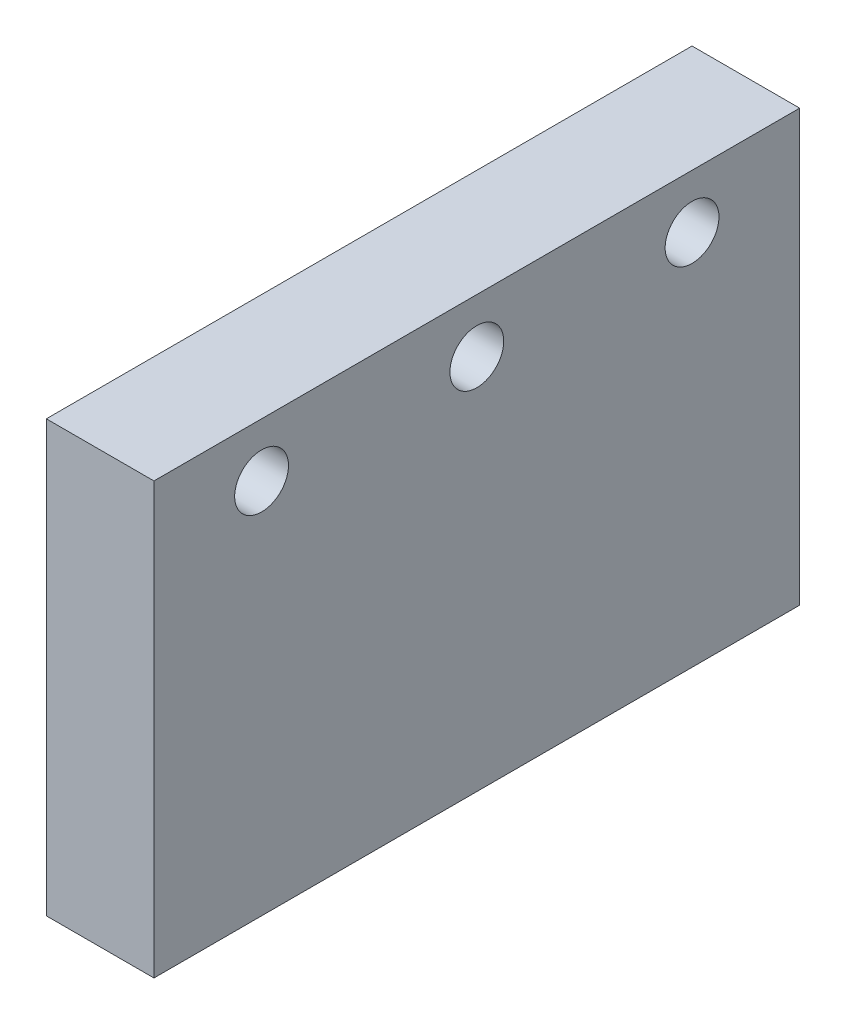
ISO-10303-21;
HEADER;
FILE_DESCRIPTION(('STEP AP214'),'2;1');
FILE_NAME('part.step','',(''),(''),'','','');
FILE_SCHEMA(('AUTOMOTIVE_DESIGN { 1 0 10303 214 1 1 1 1 }'));
ENDSEC;
DATA;
#1=APPLICATION_CONTEXT('core data for automotive mechanical design processes');
#2=APPLICATION_PROTOCOL_DEFINITION('international standard','automotive_design',2000,#1);
#3=PRODUCT_CONTEXT('',#1,'mechanical');
#4=PRODUCT('Part','Part','',(#3));
#5=PRODUCT_RELATED_PRODUCT_CATEGORY('part','',(#4));
#6=PRODUCT_DEFINITION_FORMATION('','',#4);
#7=PRODUCT_DEFINITION_CONTEXT('part definition',#1,'design');
#8=PRODUCT_DEFINITION('design','',#6,#7);
#9=PRODUCT_DEFINITION_SHAPE('','',#8);
#10=(LENGTH_UNIT() NAMED_UNIT(*) SI_UNIT(.MILLI.,.METRE.));
#11=(NAMED_UNIT(*) PLANE_ANGLE_UNIT() SI_UNIT($,.RADIAN.));
#12=(NAMED_UNIT(*) SI_UNIT($,.STERADIAN.) SOLID_ANGLE_UNIT());
#13=UNCERTAINTY_MEASURE_WITH_UNIT(LENGTH_MEASURE(1.E-05),#10,'distance_accuracy_value','');
#14=(GEOMETRIC_REPRESENTATION_CONTEXT(3) GLOBAL_UNCERTAINTY_ASSIGNED_CONTEXT((#13)) GLOBAL_UNIT_ASSIGNED_CONTEXT((#10,
#11,#12)) REPRESENTATION_CONTEXT('',''));
#15=CARTESIAN_POINT('',(0.,0.,0.));
#16=DIRECTION('',(0.,0.,1.));
#17=DIRECTION('',(1.,0.,0.));
#18=AXIS2_PLACEMENT_3D('',#15,#16,#17);
#19=CARTESIAN_POINT('',(6.35000000000004,-12.7,38.1));
#20=DIRECTION('',(-1.,0.,0.));
#21=DIRECTION('',(0.,-1.,0.));
#22=AXIS2_PLACEMENT_3D('',#19,#20,#21);
#23=PLANE('',#22);
#24=CARTESIAN_POINT('',(6.35000000000004,19.05,0.));
#25=DIRECTION('',(1.,0.,0.));
#26=DIRECTION('',(0.,0.,-1.));
#27=AXIS2_PLACEMENT_3D('',#24,#25,#26);
#28=CIRCLE('',#27,3.175);
#29=CARTESIAN_POINT('',(6.35000000000004,19.05,-3.175));
#30=VERTEX_POINT('',#29);
#31=EDGE_CURVE('E122',#30,#30,#28,.T.);
#32=ORIENTED_EDGE('',*,*,#31,.F.);
#33=EDGE_LOOP('',(#32));
#34=FACE_BOUND('',#33,.T.);
#35=CARTESIAN_POINT('',(6.35000000000004,19.05,-25.4));
#36=DIRECTION('',(1.,0.,0.));
#37=DIRECTION('',(0.,0.,-1.));
#38=AXIS2_PLACEMENT_3D('',#35,#36,#37);
#39=CIRCLE('',#38,3.175);
#40=CARTESIAN_POINT('',(6.35000000000004,19.05,-28.575));
#41=VERTEX_POINT('',#40);
#42=EDGE_CURVE('E130',#41,#41,#39,.T.);
#43=ORIENTED_EDGE('',*,*,#42,.F.);
#44=EDGE_LOOP('',(#43));
#45=FACE_BOUND('',#44,.T.);
#46=DIRECTION('',(0.,1.,0.));
#47=VECTOR('',#46,1.);
#48=CARTESIAN_POINT('',(6.35000000000004,-12.7,-38.1));
#49=LINE('',#48,#47);
#50=CARTESIAN_POINT('',(6.35000000000005,-25.4,-38.1));
#51=VERTEX_POINT('',#50);
#52=CARTESIAN_POINT('',(6.35000000000004,25.4,-38.1));
#53=VERTEX_POINT('',#52);
#54=EDGE_CURVE('E104',#51,#53,#49,.T.);
#55=ORIENTED_EDGE('',*,*,#54,.T.);
#56=DIRECTION('',(0.,0.,-1.));
#57=VECTOR('',#56,1.);
#58=CARTESIAN_POINT('',(6.35000000000004,25.4,38.1));
#59=LINE('',#58,#57);
#60=CARTESIAN_POINT('',(6.35000000000004,25.4,38.1));
#61=VERTEX_POINT('',#60);
#62=EDGE_CURVE('E11',#61,#53,#59,.T.);
#63=ORIENTED_EDGE('',*,*,#62,.F.);
#64=DIRECTION('',(0.,1.,0.));
#65=VECTOR('',#64,1.);
#66=CARTESIAN_POINT('',(6.35000000000004,25.4,38.1));
#67=LINE('',#66,#65);
#68=CARTESIAN_POINT('',(6.35000000000005,-25.4,38.1));
#69=VERTEX_POINT('',#68);
#70=EDGE_CURVE('E52',#69,#61,#67,.T.);
#71=ORIENTED_EDGE('',*,*,#70,.F.);
#72=DIRECTION('',(0.,0.,-1.));
#73=VECTOR('',#72,1.);
#74=CARTESIAN_POINT('',(6.35000000000005,-25.4,38.1));
#75=LINE('',#74,#73);
#76=EDGE_CURVE('E96',#69,#51,#75,.T.);
#77=ORIENTED_EDGE('',*,*,#76,.T.);
#78=EDGE_LOOP('',(#55,#63,#71,#77));
#79=FACE_BOUND('',#78,.T.);
#80=CARTESIAN_POINT('',(6.35000000000004,19.05,25.4));
#81=DIRECTION('',(1.,0.,0.));
#82=DIRECTION('',(0.,0.,-1.));
#83=AXIS2_PLACEMENT_3D('',#80,#81,#82);
#84=CIRCLE('',#83,3.175);
#85=CARTESIAN_POINT('',(6.35000000000004,19.05,22.225));
#86=VERTEX_POINT('',#85);
#87=EDGE_CURVE('E117',#86,#86,#84,.T.);
#88=ORIENTED_EDGE('',*,*,#87,.F.);
#89=EDGE_LOOP('',(#88));
#90=FACE_BOUND('',#89,.T.);
#91=ADVANCED_FACE('F35',(#34,#45,#79,#90),#23,.F.);
#92=CARTESIAN_POINT('',(-6.35,25.4,38.1));
#93=DIRECTION('',(0.,-1.,0.));
#94=DIRECTION('',(0.,0.,-1.));
#95=AXIS2_PLACEMENT_3D('',#92,#93,#94);
#96=PLANE('',#95);
#97=DIRECTION('',(-1.,0.,0.));
#98=VECTOR('',#97,1.);
#99=CARTESIAN_POINT('',(-6.35,25.4,-38.1));
#100=LINE('',#99,#98);
#101=CARTESIAN_POINT('',(-6.35,25.4,-38.1));
#102=VERTEX_POINT('',#101);
#103=EDGE_CURVE('E90',#53,#102,#100,.T.);
#104=ORIENTED_EDGE('',*,*,#103,.T.);
#105=DIRECTION('',(0.,0.,-1.));
#106=VECTOR('',#105,1.);
#107=CARTESIAN_POINT('',(-6.35,25.4,38.1));
#108=LINE('',#107,#106);
#109=CARTESIAN_POINT('',(-6.35,25.4,38.1));
#110=VERTEX_POINT('',#109);
#111=EDGE_CURVE('E44',#110,#102,#108,.T.);
#112=ORIENTED_EDGE('',*,*,#111,.F.);
#113=DIRECTION('',(-1.,0.,0.));
#114=VECTOR('',#113,1.);
#115=CARTESIAN_POINT('',(-6.35,25.4,38.1));
#116=LINE('',#115,#114);
#117=EDGE_CURVE('E82',#61,#110,#116,.T.);
#118=ORIENTED_EDGE('',*,*,#117,.F.);
#119=ORIENTED_EDGE('',*,*,#62,.T.);
#120=EDGE_LOOP('',(#104,#112,#118,#119));
#121=FACE_BOUND('',#120,.T.);
#122=ADVANCED_FACE('F37',(#121),#96,.F.);
#123=CARTESIAN_POINT('',(-6.35,12.7,38.1));
#124=DIRECTION('',(1.,0.,0.));
#125=DIRECTION('',(0.,1.,0.));
#126=AXIS2_PLACEMENT_3D('',#123,#124,#125);
#127=PLANE('',#126);
#128=CARTESIAN_POINT('',(-6.35000000000001,19.05,25.4));
#129=DIRECTION('',(1.,0.,0.));
#130=DIRECTION('',(0.,0.,-1.));
#131=AXIS2_PLACEMENT_3D('',#128,#129,#130);
#132=CIRCLE('',#131,3.175);
#133=CARTESIAN_POINT('',(-6.35000000000001,19.05,22.225));
#134=VERTEX_POINT('',#133);
#135=EDGE_CURVE('E119',#134,#134,#132,.T.);
#136=ORIENTED_EDGE('',*,*,#135,.T.);
#137=EDGE_LOOP('',(#136));
#138=FACE_BOUND('',#137,.T.);
#139=CARTESIAN_POINT('',(-6.35000000000001,19.05,0.));
#140=DIRECTION('',(1.,0.,0.));
#141=DIRECTION('',(0.,0.,-1.));
#142=AXIS2_PLACEMENT_3D('',#139,#140,#141);
#143=CIRCLE('',#142,3.175);
#144=CARTESIAN_POINT('',(-6.35000000000001,19.05,-3.175));
#145=VERTEX_POINT('',#144);
#146=EDGE_CURVE('E127',#145,#145,#143,.T.);
#147=ORIENTED_EDGE('',*,*,#146,.T.);
#148=EDGE_LOOP('',(#147));
#149=FACE_BOUND('',#148,.T.);
#150=CARTESIAN_POINT('',(-6.35000000000001,19.05,-25.4));
#151=DIRECTION('',(1.,0.,0.));
#152=DIRECTION('',(0.,0.,-1.));
#153=AXIS2_PLACEMENT_3D('',#150,#151,#152);
#154=CIRCLE('',#153,3.175);
#155=CARTESIAN_POINT('',(-6.35000000000001,19.05,-28.575));
#156=VERTEX_POINT('',#155);
#157=EDGE_CURVE('E101',#156,#156,#154,.T.);
#158=ORIENTED_EDGE('',*,*,#157,.T.);
#159=EDGE_LOOP('',(#158));
#160=FACE_BOUND('',#159,.T.);
#161=DIRECTION('',(0.,-1.,0.));
#162=VECTOR('',#161,1.);
#163=CARTESIAN_POINT('',(-6.35,12.7,-38.1));
#164=LINE('',#163,#162);
#165=CARTESIAN_POINT('',(-6.35,-25.4,-38.1));
#166=VERTEX_POINT('',#165);
#167=EDGE_CURVE('E69',#102,#166,#164,.T.);
#168=ORIENTED_EDGE('',*,*,#167,.T.);
#169=DIRECTION('',(0.,0.,-1.));
#170=VECTOR('',#169,1.);
#171=CARTESIAN_POINT('',(-6.35,-25.4,38.1));
#172=LINE('',#171,#170);
#173=CARTESIAN_POINT('',(-6.35,-25.4,38.1));
#174=VERTEX_POINT('',#173);
#175=EDGE_CURVE('E91',#174,#166,#172,.T.);
#176=ORIENTED_EDGE('',*,*,#175,.F.);
#177=DIRECTION('',(0.,-1.,0.));
#178=VECTOR('',#177,1.);
#179=CARTESIAN_POINT('',(-6.35,25.4,38.1));
#180=LINE('',#179,#178);
#181=EDGE_CURVE('E86',#110,#174,#180,.T.);
#182=ORIENTED_EDGE('',*,*,#181,.F.);
#183=ORIENTED_EDGE('',*,*,#111,.T.);
#184=EDGE_LOOP('',(#168,#176,#182,#183));
#185=FACE_BOUND('',#184,.T.);
#186=ADVANCED_FACE('F92',(#138,#149,#160,#185),#127,.F.);
#187=CARTESIAN_POINT('',(-6.35,-25.4,38.1));
#188=DIRECTION('',(0.,1.,0.));
#189=DIRECTION('',(-1.,0.,0.));
#190=AXIS2_PLACEMENT_3D('',#187,#188,#189);
#191=PLANE('',#190);
#192=DIRECTION('',(1.,0.,0.));
#193=VECTOR('',#192,1.);
#194=CARTESIAN_POINT('',(-6.35,-25.4,-38.1));
#195=LINE('',#194,#193);
#196=EDGE_CURVE('E76',#166,#51,#195,.T.);
#197=ORIENTED_EDGE('',*,*,#196,.T.);
#198=ORIENTED_EDGE('',*,*,#76,.F.);
#199=DIRECTION('',(1.,0.,0.));
#200=VECTOR('',#199,1.);
#201=CARTESIAN_POINT('',(-6.35,-25.4,38.1));
#202=LINE('',#201,#200);
#203=EDGE_CURVE('E94',#174,#69,#202,.T.);
#204=ORIENTED_EDGE('',*,*,#203,.F.);
#205=ORIENTED_EDGE('',*,*,#175,.T.);
#206=EDGE_LOOP('',(#197,#198,#204,#205));
#207=FACE_BOUND('',#206,.T.);
#208=ADVANCED_FACE('F107',(#207),#191,.F.);
#209=CARTESIAN_POINT('',(0.,0.,38.1));
#210=DIRECTION('',(0.,0.,1.));
#211=DIRECTION('',(1.,0.,0.));
#212=AXIS2_PLACEMENT_3D('',#209,#210,#211);
#213=PLANE('',#212);
#214=ORIENTED_EDGE('',*,*,#70,.T.);
#215=ORIENTED_EDGE('',*,*,#117,.T.);
#216=ORIENTED_EDGE('',*,*,#181,.T.);
#217=ORIENTED_EDGE('',*,*,#203,.T.);
#218=EDGE_LOOP('',(#214,#215,#216,#217));
#219=FACE_BOUND('',#218,.T.);
#220=ADVANCED_FACE('F84',(#219),#213,.T.);
#221=CARTESIAN_POINT('',(0.,0.,-38.1));
#222=DIRECTION('',(0.,0.,1.));
#223=DIRECTION('',(1.,0.,0.));
#224=AXIS2_PLACEMENT_3D('',#221,#222,#223);
#225=PLANE('',#224);
#226=ORIENTED_EDGE('',*,*,#103,.F.);
#227=ORIENTED_EDGE('',*,*,#54,.F.);
#228=ORIENTED_EDGE('',*,*,#196,.F.);
#229=ORIENTED_EDGE('',*,*,#167,.F.);
#230=EDGE_LOOP('',(#226,#227,#228,#229));
#231=FACE_BOUND('',#230,.T.);
#232=ADVANCED_FACE('F110',(#231),#225,.F.);
#233=CARTESIAN_POINT('',(6.35000000000004,19.05,-25.4));
#234=DIRECTION('',(1.,0.,0.));
#235=DIRECTION('',(0.,0.,-1.));
#236=AXIS2_PLACEMENT_3D('',#233,#234,#235);
#237=CYLINDRICAL_SURFACE('',#236,3.175);
#238=ORIENTED_EDGE('',*,*,#157,.F.);
#239=EDGE_LOOP('',(#238));
#240=FACE_BOUND('',#239,.T.);
#241=ORIENTED_EDGE('',*,*,#42,.T.);
#242=EDGE_LOOP('',(#241));
#243=FACE_BOUND('',#242,.T.);
#244=ADVANCED_FACE('F137',(#240,#243),#237,.F.);
#245=CARTESIAN_POINT('',(6.35000000000004,19.05,0.));
#246=DIRECTION('',(1.,0.,0.));
#247=DIRECTION('',(0.,0.,-1.));
#248=AXIS2_PLACEMENT_3D('',#245,#246,#247);
#249=CYLINDRICAL_SURFACE('',#248,3.175);
#250=ORIENTED_EDGE('',*,*,#146,.F.);
#251=EDGE_LOOP('',(#250));
#252=FACE_BOUND('',#251,.T.);
#253=ORIENTED_EDGE('',*,*,#31,.T.);
#254=EDGE_LOOP('',(#253));
#255=FACE_BOUND('',#254,.T.);
#256=ADVANCED_FACE('F140',(#252,#255),#249,.F.);
#257=CARTESIAN_POINT('',(6.35000000000004,19.05,25.4));
#258=DIRECTION('',(1.,0.,0.));
#259=DIRECTION('',(0.,0.,-1.));
#260=AXIS2_PLACEMENT_3D('',#257,#258,#259);
#261=CYLINDRICAL_SURFACE('',#260,3.175);
#262=ORIENTED_EDGE('',*,*,#135,.F.);
#263=EDGE_LOOP('',(#262));
#264=FACE_BOUND('',#263,.T.);
#265=ORIENTED_EDGE('',*,*,#87,.T.);
#266=EDGE_LOOP('',(#265));
#267=FACE_BOUND('',#266,.T.);
#268=ADVANCED_FACE('F148',(#264,#267),#261,.F.);
#269=CLOSED_SHELL('',(#91,#122,#186,#208,#220,#232,#244,#256,#268));
#270=MANIFOLD_SOLID_BREP('B2',#269);
#271=ADVANCED_BREP_SHAPE_REPRESENTATION('',(#18,#270),#14);
#272=SHAPE_DEFINITION_REPRESENTATION(#9,#271);
ENDSEC;
END-ISO-10303-21;
